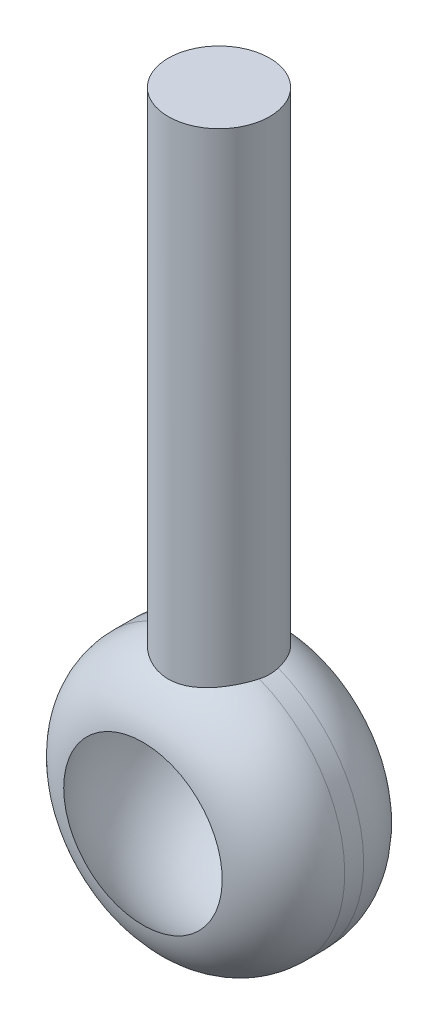
ISO-10303-21;
HEADER;
FILE_DESCRIPTION(('STEP AP214'),'2;1');
FILE_NAME('part.step','',(''),(''),'','','');
FILE_SCHEMA(('AUTOMOTIVE_DESIGN { 1 0 10303 214 1 1 1 1 }'));
ENDSEC;
DATA;
#1=APPLICATION_CONTEXT('core data for automotive mechanical design processes');
#2=APPLICATION_PROTOCOL_DEFINITION('international standard','automotive_design',2000,#1);
#3=PRODUCT_CONTEXT('',#1,'mechanical');
#4=PRODUCT('Part','Part','',(#3));
#5=PRODUCT_RELATED_PRODUCT_CATEGORY('part','',(#4));
#6=PRODUCT_DEFINITION_FORMATION('','',#4);
#7=PRODUCT_DEFINITION_CONTEXT('part definition',#1,'design');
#8=PRODUCT_DEFINITION('design','',#6,#7);
#9=PRODUCT_DEFINITION_SHAPE('','',#8);
#10=(LENGTH_UNIT() NAMED_UNIT(*) SI_UNIT(.MILLI.,.METRE.));
#11=(NAMED_UNIT(*) PLANE_ANGLE_UNIT() SI_UNIT($,.RADIAN.));
#12=(NAMED_UNIT(*) SI_UNIT($,.STERADIAN.) SOLID_ANGLE_UNIT());
#13=UNCERTAINTY_MEASURE_WITH_UNIT(LENGTH_MEASURE(1.E-05),#10,'distance_accuracy_value','');
#14=(GEOMETRIC_REPRESENTATION_CONTEXT(3) GLOBAL_UNCERTAINTY_ASSIGNED_CONTEXT((#13)) GLOBAL_UNIT_ASSIGNED_CONTEXT((#10,
#11,#12)) REPRESENTATION_CONTEXT('',''));
#15=CARTESIAN_POINT('',(0.,0.,0.));
#16=DIRECTION('',(0.,0.,1.));
#17=DIRECTION('',(1.,0.,0.));
#18=AXIS2_PLACEMENT_3D('',#15,#16,#17);
#19=CARTESIAN_POINT('',(0.,36.,0.));
#20=DIRECTION('',(0.,1.,0.));
#21=DIRECTION('',(0.,0.,1.));
#22=AXIS2_PLACEMENT_3D('',#19,#20,#21);
#23=PLANE('',#22);
#24=CARTESIAN_POINT('',(0.,36.,0.));
#25=DIRECTION('',(0.,-1.,0.));
#26=DIRECTION('',(0.,0.,-1.));
#27=AXIS2_PLACEMENT_3D('',#24,#25,#26);
#28=CIRCLE('',#27,3.);
#29=CARTESIAN_POINT('',(0.,36.,-3.));
#30=VERTEX_POINT('',#29);
#31=EDGE_CURVE('E104',#30,#30,#28,.T.);
#32=ORIENTED_EDGE('',*,*,#31,.F.);
#33=EDGE_LOOP('',(#32));
#34=FACE_BOUND('',#33,.T.);
#35=ADVANCED_FACE('F38',(#34),#23,.T.);
#36=CARTESIAN_POINT('',(0.,0.,4.5));
#37=DIRECTION('',(0.,0.,-1.));
#38=DIRECTION('',(-1.,0.,0.));
#39=AXIS2_PLACEMENT_3D('',#36,#37,#38);
#40=CYLINDRICAL_SURFACE('',#39,8.);
#41=CARTESIAN_POINT('',(0.,8.,3.));
#42=CARTESIAN_POINT('',(0.162218842303632,7.99999179258909,2.99998883541571));
#43=CARTESIAN_POINT('',(0.32459724785106,7.99501272405032,2.98677829589102));
#44=CARTESIAN_POINT('',(0.644673504964836,7.97560136905888,2.93441368053213));
#45=CARTESIAN_POINT('',(0.802363825961327,7.96115465050759,2.89521999599549));
#46=CARTESIAN_POINT('',(1.10813814591898,7.9243727992965,2.7924844988798));
#47=CARTESIAN_POINT('',(1.25624601984268,7.90205824201087,2.729006157225));
#48=CARTESIAN_POINT('',(1.53964440000884,7.85176658744964,2.57975987248181));
#49=CARTESIAN_POINT('',(1.67493558383881,7.82378978976857,2.49399310862691));
#50=CARTESIAN_POINT('',(1.9346891200047,7.76372558483114,2.29877716703411));
#51=CARTESIAN_POINT('',(2.05853554723575,7.73152152791065,2.18854456717863));
#52=CARTESIAN_POINT('',(2.28648377916198,7.66720592188017,1.94918513186896));
#53=CARTESIAN_POINT('',(2.39057862423753,7.63509440928927,1.8200516648361));
#54=CARTESIAN_POINT('',(2.57996406613465,7.57324938461639,1.5405649563816));
#55=CARTESIAN_POINT('',(2.66438796802243,7.5436529339983,1.38959105582033));
#56=CARTESIAN_POINT('',(2.80637301826854,7.49199717575482,1.07430306825259));
#57=CARTESIAN_POINT('',(2.8639449328426,7.46993484829952,0.90999435886977));
#58=CARTESIAN_POINT('',(2.94816863458442,7.43708824911684,0.57976644738333));
#59=CARTESIAN_POINT('',(2.97599188500963,7.42587847723187,0.414189775820647));
#60=CARTESIAN_POINT('',(3.00359113443141,7.4147612291611,0.0803675358949781));
#61=CARTESIAN_POINT('',(3.00337874130838,7.41484907530811,-0.0878768990567039));
#62=CARTESIAN_POINT('',(2.97580860618697,7.42595022302475,-0.411538761180788));
#63=CARTESIAN_POINT('',(2.95007622727784,7.43630934027226,-0.5671212420212));
#64=CARTESIAN_POINT('',(2.87488358060584,7.46569868851318,-0.871573735907976));
#65=CARTESIAN_POINT('',(2.82541965141161,7.48473025751641,-1.02044270927959));
#66=CARTESIAN_POINT('',(2.7032734094943,7.52971457154971,-1.31055753026041));
#67=CARTESIAN_POINT('',(2.63016906374988,7.55579158259845,-1.45160558018174));
#68=CARTESIAN_POINT('',(2.46311770242011,7.61188556041071,-1.71989720705547));
#69=CARTESIAN_POINT('',(2.36916444443631,7.64190370609268,-1.84713663252466));
#70=CARTESIAN_POINT('',(2.15565035593563,7.70495586981356,-2.09318831583589));
#71=CARTESIAN_POINT('',(2.03479468728345,7.73805713109076,-2.21086303836618));
#72=CARTESIAN_POINT('',(1.77467657153371,7.8018247459396,-2.42464435086036));
#73=CARTESIAN_POINT('',(1.63540567358529,7.83248997119547,-2.52074098355783));
#74=CARTESIAN_POINT('',(1.33929583128925,7.88855176687111,-2.68993613576149));
#75=CARTESIAN_POINT('',(1.18220994072885,7.913855467045,-2.76263907534527));
#76=CARTESIAN_POINT('',(0.93851325706045,7.94518418048637,-2.85073292475686));
#77=CARTESIAN_POINT('',(0.855970616449073,7.95452022883643,-2.87659802509444));
#78=CARTESIAN_POINT('',(0.688746254663311,7.97073800471096,-2.92114720900516));
#79=CARTESIAN_POINT('',(0.604065480457102,7.97762079903771,-2.93983441417516));
#80=CARTESIAN_POINT('',(0.433191039875368,7.98872189147604,-2.96982707461691));
#81=CARTESIAN_POINT('',(0.346996681338565,7.99293893611189,-2.98112905732969));
#82=CARTESIAN_POINT('',(0.173883499776142,7.99858018613403,-2.99621850131796));
#83=CARTESIAN_POINT('',(0.0869646789380775,8.00000439995037,-3.00000598527566));
#84=CARTESIAN_POINT('',(-0.162218842303631,7.99999179258909,-2.99998883541571));
#85=CARTESIAN_POINT('',(-0.32459724785106,7.99501272405032,-2.98677829589102));
#86=CARTESIAN_POINT('',(-0.644673504964835,7.97560136905888,-2.93441368053213));
#87=CARTESIAN_POINT('',(-0.802363825961326,7.96115465050759,-2.89521999599549));
#88=CARTESIAN_POINT('',(-1.10813814591898,7.9243727992965,-2.7924844988798));
#89=CARTESIAN_POINT('',(-1.25624601984268,7.90205824201087,-2.729006157225));
#90=CARTESIAN_POINT('',(-1.53964440000884,7.85176658744964,-2.57975987248181));
#91=CARTESIAN_POINT('',(-1.67493558383881,7.82378978976857,-2.49399310862691));
#92=CARTESIAN_POINT('',(-1.9346891200047,7.76372558483114,-2.29877716703411));
#93=CARTESIAN_POINT('',(-2.05853554723575,7.73152152791065,-2.18854456717863));
#94=CARTESIAN_POINT('',(-2.28648377916198,7.66720592188017,-1.94918513186896));
#95=CARTESIAN_POINT('',(-2.39057862423753,7.63509440928927,-1.8200516648361));
#96=CARTESIAN_POINT('',(-2.57996406613465,7.5732493846164,-1.5405649563816));
#97=CARTESIAN_POINT('',(-2.66438796802243,7.5436529339983,-1.38959105582033));
#98=CARTESIAN_POINT('',(-2.80637301826854,7.49199717575482,-1.07430306825259));
#99=CARTESIAN_POINT('',(-2.8639449328426,7.46993484829952,-0.909994358869771));
#100=CARTESIAN_POINT('',(-2.94816863458442,7.43708824911684,-0.57976644738333));
#101=CARTESIAN_POINT('',(-2.97599188500963,7.42587847723187,-0.414189775820646));
#102=CARTESIAN_POINT('',(-3.00359113443141,7.4147612291611,-0.0803675358949775));
#103=CARTESIAN_POINT('',(-3.00337874130838,7.41484907530811,0.0878768990567041));
#104=CARTESIAN_POINT('',(-2.97580860618697,7.42595022302475,0.411538761180788));
#105=CARTESIAN_POINT('',(-2.95007622727784,7.43630934027226,0.567121242021199));
#106=CARTESIAN_POINT('',(-2.87488358060584,7.46569868851318,0.871573735907975));
#107=CARTESIAN_POINT('',(-2.82541965141161,7.48473025751641,1.02044270927959));
#108=CARTESIAN_POINT('',(-2.7032734094943,7.52971457154971,1.31055753026041));
#109=CARTESIAN_POINT('',(-2.63016906374988,7.55579158259845,1.45160558018174));
#110=CARTESIAN_POINT('',(-2.46311770242011,7.61188556041071,1.71989720705547));
#111=CARTESIAN_POINT('',(-2.36916444443631,7.64190370609268,1.84713663252466));
#112=CARTESIAN_POINT('',(-2.15565035593563,7.70495586981356,2.09318831583589));
#113=CARTESIAN_POINT('',(-2.03479468728345,7.73805713109076,2.21086303836618));
#114=CARTESIAN_POINT('',(-1.7746765715337,7.8018247459396,2.42464435086036));
#115=CARTESIAN_POINT('',(-1.63540567358529,7.83248997119547,2.52074098355783));
#116=CARTESIAN_POINT('',(-1.33929583128925,7.88855176687111,2.68993613576149));
#117=CARTESIAN_POINT('',(-1.18220994072886,7.913855467045,2.76263907534527));
#118=CARTESIAN_POINT('',(-0.938513257060451,7.94518418048637,2.85073292475686));
#119=CARTESIAN_POINT('',(-0.855970616449072,7.95452022883643,2.87659802509444));
#120=CARTESIAN_POINT('',(-0.688746254663309,7.97073800471096,2.92114720900516));
#121=CARTESIAN_POINT('',(-0.604065480457102,7.97762079903771,2.93983441417516));
#122=CARTESIAN_POINT('',(-0.433191039875368,7.98872189147604,2.96982707461691));
#123=CARTESIAN_POINT('',(-0.346996681338565,7.99293893611189,2.98112905732969));
#124=CARTESIAN_POINT('',(-0.173883499776142,7.99858018613403,2.99621850131796));
#125=CARTESIAN_POINT('',(-0.0869646789380771,8.00000439995037,3.00000598527566));
#126=CARTESIAN_POINT('',(0.,8.,3.));
#127=B_SPLINE_CURVE_WITH_KNOTS('',3,(#41,#42,#43,#44,#45,#46,#47,#48,#49,#50,#51,#52,#53,#54,
#55,#56,#57,#58,#59,#60,#61,#62,#63,#64,#65,#66,#67,#68,#69,#70,#71,#72,#73,#74,#75,#76,#77,#78,
#79,#80,#81,#82,#83,#84,#85,#86,#87,#88,#89,#90,#91,#92,#93,#94,#95,#96,#97,#98,#99,#100,#101,
#102,#103,#104,#105,#106,#107,#108,#109,#110,#111,#112,#113,#114,#115,#116,#117,#118,#119,#120,
#121,#122,#123,#124,#125,#126),.UNSPECIFIED.,.T.,.F.,(4,2,2,2,2,2,2,2,2,2,2,2,2,2,2,2,2,2,2,2,2,
2,2,2,2,2,2,2,2,2,2,2,2,2,2,2,2,2,2,2,2,2,4),(0.,0.486333028604592,0.973409133198437,
1.45922080708889,1.94500678293758,2.44946074283351,2.95409212216245,3.47793387324542,
4.00156541076857,4.50371773332208,5.00566214533485,5.47756604955742,5.94954278508064,
6.43045921805251,6.91151983755537,7.42484431103955,7.93840517487802,8.4602422626175,
8.72095472409521,8.9815536755379,9.24227507356821,9.50299568462039,9.98932871322498,
10.4764048178188,10.9622164917093,11.448002467558,11.9524564274539,12.4570878067828,
12.9809295578658,13.504561095389,14.0067134179425,14.5086578299552,14.9805617341778,
15.452538469701,15.9334549026729,16.4145155221758,16.9278399956599,17.4414008594984,
17.9632379472379,18.2239504087156,18.4845493601583,18.7452707581886,19.0059913692408),.UNSPECIFIED.);
#128=CARTESIAN_POINT('',(2.94726331800043,7.43731395964762,0.560034761753515));
#129=VERTEX_POINT('',#128);
#130=CARTESIAN_POINT('',(2.94726331799981,7.43731395964785,-0.560034761753927));
#131=VERTEX_POINT('',#130);
#132=EDGE_CURVE('E71',#129,#131,#127,.T.);
#133=ORIENTED_EDGE('',*,*,#132,.F.);
#134=CARTESIAN_POINT('',(0.,0.,0.560034761753927));
#135=DIRECTION('',(0.,0.,1.));
#136=DIRECTION('',(1.,0.,0.));
#137=AXIS2_PLACEMENT_3D('',#134,#135,#136);
#138=CIRCLE('',#137,8.);
#139=CARTESIAN_POINT('',(-2.94726331799981,7.43731395964785,0.560034761753927));
#140=VERTEX_POINT('',#139);
#141=EDGE_CURVE('E73',#129,#140,#138,.F.);
#142=ORIENTED_EDGE('',*,*,#141,.T.);
#143=CARTESIAN_POINT('',(-2.94726331800043,7.43731395964761,-0.560034761753515));
#144=VERTEX_POINT('',#143);
#145=EDGE_CURVE('E72',#144,#140,#127,.T.);
#146=ORIENTED_EDGE('',*,*,#145,.F.);
#147=CARTESIAN_POINT('',(0.,0.,-0.560034761753927));
#148=DIRECTION('',(0.,0.,-1.));
#149=DIRECTION('',(-1.,0.,0.));
#150=AXIS2_PLACEMENT_3D('',#147,#148,#149);
#151=CIRCLE('',#150,8.);
#152=EDGE_CURVE('E78',#144,#131,#151,.F.);
#153=ORIENTED_EDGE('',*,*,#152,.T.);
#154=EDGE_LOOP('',(#133,#142,#146,#153));
#155=FACE_BOUND('',#154,.T.);
#156=ADVANCED_FACE('F76',(#155),#40,.T.);
#157=CARTESIAN_POINT('',(0.,36.,0.));
#158=DIRECTION('',(0.,-1.,0.));
#159=DIRECTION('',(0.,0.,-1.));
#160=AXIS2_PLACEMENT_3D('',#157,#158,#159);
#161=CYLINDRICAL_SURFACE('',#160,3.);
#162=ORIENTED_EDGE('',*,*,#132,.T.);
#163=CARTESIAN_POINT('',(2.94726331799981,7.43731395964785,-0.560034761753927));
#164=CARTESIAN_POINT('',(2.93227606210345,7.44326450966973,-0.638968340505448));
#165=CARTESIAN_POINT('',(2.91407878698468,7.44789899375009,-0.717384599597012));
#166=CARTESIAN_POINT('',(2.87141957406984,7.45465792152838,-0.87258669647146));
#167=CARTESIAN_POINT('',(2.84695902212291,7.45678291990676,-0.94937289086707));
#168=CARTESIAN_POINT('',(2.79199854186948,7.45864489260631,-1.10054360298366));
#169=CARTESIAN_POINT('',(2.76151563000402,7.45838850380756,-1.17493421605856));
#170=CARTESIAN_POINT('',(2.69471059730527,7.45568142048587,-1.32098151906215));
#171=CARTESIAN_POINT('',(2.65838834837463,7.45323067782008,-1.39263814897286));
#172=CARTESIAN_POINT('',(2.54106362634375,7.44288745767522,-1.60270110479713));
#173=CARTESIAN_POINT('',(2.45163654143689,7.43200529343113,-1.73638310027368));
#174=CARTESIAN_POINT('',(2.25300183520737,7.40437819747483,-1.98737545793511));
#175=CARTESIAN_POINT('',(2.1437850898195,7.38763055813634,-2.10467822408572));
#176=CARTESIAN_POINT('',(1.90487950321688,7.35038732863532,-2.32345193752553));
#177=CARTESIAN_POINT('',(1.77467719373995,7.32979484556947,-2.42434629156934));
#178=CARTESIAN_POINT('',(1.49950584652103,7.28863091630935,-2.60354844013114));
#179=CARTESIAN_POINT('',(1.35453133178807,7.2680594807949,-2.68184781572791));
#180=CARTESIAN_POINT('',(1.04810044588356,7.23004332091867,-2.81609644914896));
#181=CARTESIAN_POINT('',(0.88624947493505,7.21272992909654,-2.87118768657768));
#182=CARTESIAN_POINT('',(0.554973310917793,7.18601571665223,-2.95314720448612));
#183=CARTESIAN_POINT('',(0.385553112344272,7.17660975726603,-2.98003381698614));
#184=CARTESIAN_POINT('',(0.0510130619056925,7.1682228996415,-3.00406631741523));
#185=CARTESIAN_POINT('',(-0.114016577628047,7.16884947216899,-3.00233193587419));
#186=CARTESIAN_POINT('',(-0.441272615622469,7.17941406826965,-2.97191729844097));
#187=CARTESIAN_POINT('',(-0.603498621649009,7.18935338479911,-2.94323330093516));
#188=CARTESIAN_POINT('',(-0.916582049297353,7.21591366059795,-2.86102118034879));
#189=CARTESIAN_POINT('',(-1.06762115194898,7.23236384057618,-2.8081230311076));
#190=CARTESIAN_POINT('',(-1.3590638830609,7.26873039880031,-2.67924425642461));
#191=CARTESIAN_POINT('',(-1.49946478272326,7.28864766209417,-2.60325773347495));
#192=CARTESIAN_POINT('',(-1.7735611844282,7.32960437852369,-2.42539721439054));
#193=CARTESIAN_POINT('',(-1.90650644918608,7.35064733881449,-2.32236424422181));
#194=CARTESIAN_POINT('',(-2.15364212899777,7.3891605710188,-2.09523618268553));
#195=CARTESIAN_POINT('',(-2.26782852643581,7.40663007779609,-1.97113659098875));
#196=CARTESIAN_POINT('',(-2.47466296414583,7.43498088889759,-1.7042918840649));
#197=CARTESIAN_POINT('',(-2.5672028246,7.4458295213451,-1.56145846213944));
#198=CARTESIAN_POINT('',(-2.6869063427907,7.45522717056709,-1.3370687167874));
#199=CARTESIAN_POINT('',(-2.72361806531758,7.45721410741502,-1.2605974214584));
#200=CARTESIAN_POINT('',(-2.79044026201396,7.45868036704619,-1.10481179867098));
#201=CARTESIAN_POINT('',(-2.82055403944998,7.45816094765148,-1.02549891710368));
#202=CARTESIAN_POINT('',(-2.86818715976683,7.45482854975713,-0.882000619126987));
#203=CARTESIAN_POINT('',(-2.88702218679165,7.45253345759784,-0.818234780145688));
#204=CARTESIAN_POINT('',(-2.92037885596144,7.44622519648957,-0.689774875970551));
#205=CARTESIAN_POINT('',(-2.93490717517759,7.44221471090399,-0.625082412408041));
#206=CARTESIAN_POINT('',(-2.94726331799981,7.43731395964785,-0.560034761753927));
#207=B_SPLINE_CURVE_WITH_KNOTS('',3,(#163,#164,#165,#166,#167,#168,#169,#170,#171,#172,#173,
#174,#175,#176,#177,#178,#179,#180,#181,#182,#183,#184,#185,#186,#187,#188,#189,#190,#191,#192,
#193,#194,#195,#196,#197,#198,#199,#200,#201,#202,#203,#204,#205,#206),.UNSPECIFIED.,.F.,.F.,(4,
2,2,2,2,2,2,2,2,2,2,2,2,2,2,2,2,2,2,2,2,4),(0.,0.241605083001596,0.483156753180038,
0.724035425958441,0.964919383605662,1.44611150450508,1.92752604719365,2.42330014604316,
2.91925873321481,3.43221604886251,3.94483975321984,4.4374574693264,4.93014358928632,
5.41068242395124,5.89134410691188,6.39749121286374,6.90374658020408,7.41248037003759,
7.66675234469009,7.92089672550156,8.12032323032553,8.31943890974019),.UNSPECIFIED.);
#208=EDGE_CURVE('E11',#131,#144,#207,.T.);
#209=ORIENTED_EDGE('',*,*,#208,.T.);
#210=ORIENTED_EDGE('',*,*,#145,.T.);
#211=CARTESIAN_POINT('',(-2.94726331799981,7.43731395964785,0.560034761753927));
#212=CARTESIAN_POINT('',(-2.93227606210345,7.44326450966973,0.638968340505448));
#213=CARTESIAN_POINT('',(-2.91407878698468,7.44789899375009,0.717384599597012));
#214=CARTESIAN_POINT('',(-2.87141957406984,7.45465792152838,0.87258669647146));
#215=CARTESIAN_POINT('',(-2.84695902212291,7.45678291990676,0.94937289086707));
#216=CARTESIAN_POINT('',(-2.79199854186948,7.45864489260631,1.10054360298366));
#217=CARTESIAN_POINT('',(-2.76151563000402,7.45838850380756,1.17493421605856));
#218=CARTESIAN_POINT('',(-2.69471059730527,7.45568142048587,1.32098151906215));
#219=CARTESIAN_POINT('',(-2.65838834837463,7.45323067782008,1.39263814897286));
#220=CARTESIAN_POINT('',(-2.54106362634375,7.44288745767522,1.60270110479713));
#221=CARTESIAN_POINT('',(-2.45163654143689,7.43200529343113,1.73638310027368));
#222=CARTESIAN_POINT('',(-2.25300183520737,7.40437819747483,1.98737545793511));
#223=CARTESIAN_POINT('',(-2.1437850898195,7.38763055813634,2.10467822408572));
#224=CARTESIAN_POINT('',(-1.90487950321688,7.35038732863532,2.32345193752553));
#225=CARTESIAN_POINT('',(-1.77467719373995,7.32979484556947,2.42434629156934));
#226=CARTESIAN_POINT('',(-1.49950584652103,7.28863091630935,2.60354844013114));
#227=CARTESIAN_POINT('',(-1.35453133178807,7.2680594807949,2.68184781572791));
#228=CARTESIAN_POINT('',(-1.04810044588356,7.23004332091867,2.81609644914896));
#229=CARTESIAN_POINT('',(-0.88624947493505,7.21272992909654,2.87118768657768));
#230=CARTESIAN_POINT('',(-0.554973310917793,7.18601571665223,2.95314720448612));
#231=CARTESIAN_POINT('',(-0.385553112344272,7.17660975726603,2.98003381698614));
#232=CARTESIAN_POINT('',(-0.0510130619056925,7.1682228996415,3.00406631741523));
#233=CARTESIAN_POINT('',(0.114016577628047,7.16884947216899,3.00233193587419));
#234=CARTESIAN_POINT('',(0.441272615622469,7.17941406826965,2.97191729844097));
#235=CARTESIAN_POINT('',(0.603498621649009,7.18935338479911,2.94323330093516));
#236=CARTESIAN_POINT('',(0.916582049297353,7.21591366059795,2.86102118034879));
#237=CARTESIAN_POINT('',(1.06762115194898,7.23236384057618,2.8081230311076));
#238=CARTESIAN_POINT('',(1.3590638830609,7.26873039880031,2.67924425642461));
#239=CARTESIAN_POINT('',(1.49946478272326,7.28864766209417,2.60325773347495));
#240=CARTESIAN_POINT('',(1.7735611844282,7.32960437852369,2.42539721439054));
#241=CARTESIAN_POINT('',(1.90650644918608,7.35064733881449,2.32236424422181));
#242=CARTESIAN_POINT('',(2.15364212899777,7.3891605710188,2.09523618268553));
#243=CARTESIAN_POINT('',(2.26782852643581,7.40663007779609,1.97113659098875));
#244=CARTESIAN_POINT('',(2.47466296414583,7.43498088889759,1.7042918840649));
#245=CARTESIAN_POINT('',(2.5672028246,7.4458295213451,1.56145846213944));
#246=CARTESIAN_POINT('',(2.6869063427907,7.45522717056709,1.3370687167874));
#247=CARTESIAN_POINT('',(2.72361806531758,7.45721410741502,1.2605974214584));
#248=CARTESIAN_POINT('',(2.79044026201396,7.45868036704619,1.10481179867098));
#249=CARTESIAN_POINT('',(2.82055403944998,7.45816094765148,1.02549891710368));
#250=CARTESIAN_POINT('',(2.86818715976683,7.45482854975713,0.882000619126987));
#251=CARTESIAN_POINT('',(2.88702218679165,7.45253345759784,0.818234780145688));
#252=CARTESIAN_POINT('',(2.92037885596144,7.44622519648957,0.689774875970551));
#253=CARTESIAN_POINT('',(2.93490717517759,7.44221471090399,0.625082412408041));
#254=CARTESIAN_POINT('',(2.94726331799981,7.43731395964785,0.560034761753927));
#255=B_SPLINE_CURVE_WITH_KNOTS('',3,(#211,#212,#213,#214,#215,#216,#217,#218,#219,#220,#221,
#222,#223,#224,#225,#226,#227,#228,#229,#230,#231,#232,#233,#234,#235,#236,#237,#238,#239,#240,
#241,#242,#243,#244,#245,#246,#247,#248,#249,#250,#251,#252,#253,#254),.UNSPECIFIED.,.F.,.F.,(4,
2,2,2,2,2,2,2,2,2,2,2,2,2,2,2,2,2,2,2,2,4),(0.,0.241605083001596,0.483156753180038,
0.724035425958441,0.964919383605662,1.44611150450508,1.92752604719365,2.42330014604316,
2.91925873321481,3.43221604886251,3.94483975321984,4.4374574693264,4.93014358928632,
5.41068242395124,5.89134410691188,6.39749121286374,6.90374658020408,7.41248037003759,
7.66675234469009,7.92089672550156,8.12032323032553,8.31943890974019),.UNSPECIFIED.);
#256=EDGE_CURVE('E52',#140,#129,#255,.T.);
#257=ORIENTED_EDGE('',*,*,#256,.T.);
#258=EDGE_LOOP('',(#162,#209,#210,#257));
#259=FACE_BOUND('',#258,.T.);
#260=ORIENTED_EDGE('',*,*,#31,.T.);
#261=EDGE_LOOP('',(#260));
#262=FACE_BOUND('',#261,.T.);
#263=ADVANCED_FACE('F69',(#259,#262),#161,.T.);
#264=CARTESIAN_POINT('',(0.,0.,0.));
#265=DIRECTION('',(0.,0.,1.));
#266=DIRECTION('',(-1.,0.,0.));
#267=AXIS2_PLACEMENT_3D('',#264,#265,#266);
#268=SPHERICAL_SURFACE('',#267,6.5);
#269=CARTESIAN_POINT('',(0.,0.,4.5));
#270=DIRECTION('',(0.,0.,1.));
#271=DIRECTION('',(1.,0.,0.));
#272=AXIS2_PLACEMENT_3D('',#269,#270,#271);
#273=CIRCLE('',#272,4.69041575982343);
#274=CARTESIAN_POINT('',(-4.69041575982343,0.,4.5));
#275=VERTEX_POINT('',#274);
#276=EDGE_CURVE('E103',#275,#275,#273,.T.);
#277=CARTESIAN_POINT('',(0.,0.,-4.5));
#278=DIRECTION('',(0.,0.,1.));
#279=DIRECTION('',(1.,0.,0.));
#280=AXIS2_PLACEMENT_3D('',#277,#278,#279);
#281=CIRCLE('',#280,4.69041575982343);
#282=CARTESIAN_POINT('',(-4.69041575982343,0.,-4.5));
#283=VERTEX_POINT('',#282);
#284=EDGE_CURVE('E106',#283,#283,#281,.T.);
#285=CARTESIAN_POINT('',(-4.69041575982343,0.,4.5));
#286=CARTESIAN_POINT('',(-4.76210624204994,0.,4.42527889124895));
#287=CARTESIAN_POINT('',(-4.83200814280828,0.,4.34884204442719));
#288=CARTESIAN_POINT('',(-4.96808186456599,0.,4.19271728905302));
#289=CARTESIAN_POINT('',(-5.03425368556536,0.,4.11302938050062));
#290=CARTESIAN_POINT('',(-5.16271433098249,0.,3.95058291607592));
#291=CARTESIAN_POINT('',(-5.22500315540024,0.,3.86782436020362));
#292=CARTESIAN_POINT('',(-5.34555604093116,0.,3.69942601736772));
#293=CARTESIAN_POINT('',(-5.40382010204432,0.,3.61378623040411));
#294=CARTESIAN_POINT('',(-5.51619027400762,0.,3.43982088843359));
#295=CARTESIAN_POINT('',(-5.57029638485776,0.,3.35149533342669));
#296=CARTESIAN_POINT('',(-5.67422712872889,0.,3.17236019474046));
#297=CARTESIAN_POINT('',(-5.72405176174988,0.,3.08155061106114));
#298=CARTESIAN_POINT('',(-5.81930575610283,0.,2.89765478890912));
#299=CARTESIAN_POINT('',(-5.86473511743478,0.,2.80456855043642));
#300=CARTESIAN_POINT('',(-5.95109482380328,0.,2.61633200203106));
#301=CARTESIAN_POINT('',(-5.99202516883983,0.,2.5211816920984));
#302=CARTESIAN_POINT('',(-6.06929336926804,0.,2.32903429508149));
#303=CARTESIAN_POINT('',(-6.10563122465969,0.,2.23203720799725));
#304=CARTESIAN_POINT('',(-6.17363146116803,0.,2.03641776920925));
#305=CARTESIAN_POINT('',(-6.20529384228472,0.,1.9377954175055));
#306=CARTESIAN_POINT('',(-6.26387082277354,0.,1.73915067343224));
#307=CARTESIAN_POINT('',(-6.29078542214567,0.,1.63912828106274));
#308=CARTESIAN_POINT('',(-6.33980537425188,0.,1.43791187693933));
#309=CARTESIAN_POINT('',(-6.36191072698596,0.,1.33671786518543));
#310=CARTESIAN_POINT('',(-6.40126170378928,0.,1.13338931918914));
#311=CARTESIAN_POINT('',(-6.41850732785851,0.,1.03125478494676));
#312=CARTESIAN_POINT('',(-6.44809946347847,0.,0.826278438745693));
#313=CARTESIAN_POINT('',(-6.4604459750292,0.,0.723436626787011));
#314=CARTESIAN_POINT('',(-6.48021168986709,0.,0.517280585135567));
#315=CARTESIAN_POINT('',(-6.48763089315426,0.,0.413966355442804));
#316=CARTESIAN_POINT('',(-6.49752504822071,0.,0.207101417166695));
#317=CARTESIAN_POINT('',(-6.5,0.,0.103550708583347));
#318=CARTESIAN_POINT('',(-6.5,0.,-0.103550708583348));
#319=CARTESIAN_POINT('',(-6.49752504822071,0.,-0.207101417166695));
#320=CARTESIAN_POINT('',(-6.48763089315426,0.,-0.413966355442805));
#321=CARTESIAN_POINT('',(-6.48021168986709,0.,-0.517280585135568));
#322=CARTESIAN_POINT('',(-6.4604459750292,0.,-0.723436626787012));
#323=CARTESIAN_POINT('',(-6.44809946347847,0.,-0.826278438745694));
#324=CARTESIAN_POINT('',(-6.41850732785851,0.,-1.03125478494676));
#325=CARTESIAN_POINT('',(-6.40126170378928,0.,-1.13338931918914));
#326=CARTESIAN_POINT('',(-6.36191072698596,0.,-1.33671786518543));
#327=CARTESIAN_POINT('',(-6.33980537425188,0.,-1.43791187693933));
#328=CARTESIAN_POINT('',(-6.29078542214567,0.,-1.63912828106274));
#329=CARTESIAN_POINT('',(-6.26387082277354,0.,-1.73915067343224));
#330=CARTESIAN_POINT('',(-6.20529384228472,0.,-1.9377954175055));
#331=CARTESIAN_POINT('',(-6.17363146116803,0.,-2.03641776920926));
#332=CARTESIAN_POINT('',(-6.10563122465969,0.,-2.23203720799725));
#333=CARTESIAN_POINT('',(-6.06929336926804,0.,-2.3290342950815));
#334=CARTESIAN_POINT('',(-5.99202516883983,0.,-2.5211816920984));
#335=CARTESIAN_POINT('',(-5.95109482380328,0.,-2.61633200203106));
#336=CARTESIAN_POINT('',(-5.86473511743478,0.,-2.80456855043642));
#337=CARTESIAN_POINT('',(-5.81930575610283,0.,-2.89765478890912));
#338=CARTESIAN_POINT('',(-5.72405176174988,0.,-3.08155061106114));
#339=CARTESIAN_POINT('',(-5.67422712872889,0.,-3.17236019474046));
#340=CARTESIAN_POINT('',(-5.57029638485776,0.,-3.35149533342669));
#341=CARTESIAN_POINT('',(-5.51619027400762,0.,-3.43982088843359));
#342=CARTESIAN_POINT('',(-5.40382010204432,0.,-3.61378623040411));
#343=CARTESIAN_POINT('',(-5.34555604093116,0.,-3.69942601736772));
#344=CARTESIAN_POINT('',(-5.22500315540024,0.,-3.86782436020362));
#345=CARTESIAN_POINT('',(-5.16271433098249,0.,-3.95058291607592));
#346=CARTESIAN_POINT('',(-5.03425368556536,0.,-4.11302938050062));
#347=CARTESIAN_POINT('',(-4.96808186456599,0.,-4.19271728905302));
#348=CARTESIAN_POINT('',(-4.83200814280828,0.,-4.34884204442719));
#349=CARTESIAN_POINT('',(-4.76210624204994,0.,-4.42527889124895));
#350=CARTESIAN_POINT('',(-4.69041575982343,0.,-4.5));
#351=B_SPLINE_CURVE_WITH_KNOTS('',3,(#285,#286,#287,#288,#289,#290,#291,#292,#293,#294,#295,
#296,#297,#298,#299,#300,#301,#302,#303,#304,#305,#306,#307,#308,#309,#310,#311,#312,#313,#314,
#315,#316,#317,#318,#319,#320,#321,#322,#323,#324,#325,#326,#327,#328,#329,#330,#331,#332,#333,
#334,#335,#336,#337,#338,#339,#340,#341,#342,#343,#344,#345,#346,#347,#348,#349,#350),
.UNSPECIFIED.,.F.,.F.,(4,2,2,2,2,2,2,2,2,2,2,2,2,2,2,2,2,2,2,2,2,2,2,2,2,2,2,2,2,2,2,2,4),(0.,
0.310622570111457,0.621245140222913,0.931867710334371,1.24249028044583,1.55311285055728,
1.86373542066874,2.1743579907802,2.48498056089166,2.79560313100311,3.10622570111457,
3.41684827122603,3.72747084133748,4.03809341144894,4.3487159815604,4.65933855167185,
4.96996112178331,5.28058369189477,5.59120626200622,5.90182883211768,6.21245140222914,
6.52307397234059,6.83369654245205,7.14431911256351,7.45494168267497,7.76556425278642,
8.07618682289788,8.38680939300933,8.69743196312079,9.00805453323225,9.3186771033437,
9.62929967345516,9.93992224356662),.UNSPECIFIED.);
#352=EDGE_CURVE('BSEAM94',#275,#283,#351,.T.);
#353=ORIENTED_EDGE('',*,*,#276,.T.);
#354=ORIENTED_EDGE('',*,*,#284,.F.);
#355=ORIENTED_EDGE('',*,*,#352,.T.);
#356=ORIENTED_EDGE('',*,*,#352,.F.);
#357=EDGE_LOOP('',(#353,#355,#354,#356));
#358=FACE_BOUND('',#357,.T.);
#359=ADVANCED_FACE('F94',(#358),#268,.F.);
#360=CARTESIAN_POINT('',(0.,0.,0.560034761753927));
#361=DIRECTION('',(0.,0.,1.));
#362=DIRECTION('',(1.,0.,0.));
#363=AXIS2_PLACEMENT_3D('',#360,#361,#362);
#364=DEGENERATE_TOROIDAL_SURFACE('',#363,4.,4.,.T.);
#365=ORIENTED_EDGE('',*,*,#276,.F.);
#366=EDGE_LOOP('',(#365));
#367=FACE_BOUND('',#366,.T.);
#368=ORIENTED_EDGE('',*,*,#256,.F.);
#369=ORIENTED_EDGE('',*,*,#141,.F.);
#370=EDGE_LOOP('',(#368,#369));
#371=FACE_BOUND('',#370,.T.);
#372=ADVANCED_FACE('F80',(#367,#371),#364,.T.);
#373=CARTESIAN_POINT('',(0.,0.,-0.560034761753927));
#374=DIRECTION('',(0.,0.,-1.));
#375=DIRECTION('',(-1.,0.,0.));
#376=AXIS2_PLACEMENT_3D('',#373,#374,#375);
#377=DEGENERATE_TOROIDAL_SURFACE('',#376,4.,4.,.T.);
#378=ORIENTED_EDGE('',*,*,#284,.T.);
#379=EDGE_LOOP('',(#378));
#380=FACE_BOUND('',#379,.T.);
#381=ORIENTED_EDGE('',*,*,#208,.F.);
#382=ORIENTED_EDGE('',*,*,#152,.F.);
#383=EDGE_LOOP('',(#381,#382));
#384=FACE_BOUND('',#383,.T.);
#385=ADVANCED_FACE('F40',(#380,#384),#377,.T.);
#386=CLOSED_SHELL('',(#35,#156,#263,#359,#372,#385));
#387=MANIFOLD_SOLID_BREP('B2',#386);
#388=ADVANCED_BREP_SHAPE_REPRESENTATION('',(#18,#387),#14);
#389=SHAPE_DEFINITION_REPRESENTATION(#9,#388);
ENDSEC;
END-ISO-10303-21;
